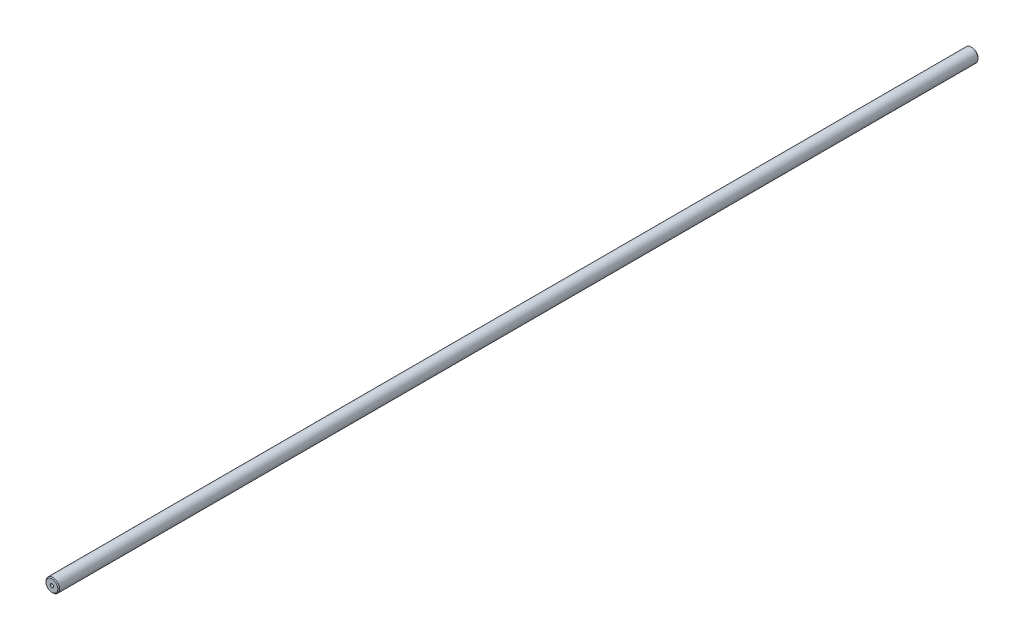
ISO-10303-21;
HEADER;
FILE_DESCRIPTION(('STEP AP214'),'2;1');
FILE_NAME('part.step','',(''),(''),'','','');
FILE_SCHEMA(('AUTOMOTIVE_DESIGN { 1 0 10303 214 1 1 1 1 }'));
ENDSEC;
DATA;
#1=APPLICATION_CONTEXT('core data for automotive mechanical design processes');
#2=APPLICATION_PROTOCOL_DEFINITION('international standard','automotive_design',2000,#1);
#3=PRODUCT_CONTEXT('',#1,'mechanical');
#4=PRODUCT('Part','Part','',(#3));
#5=PRODUCT_RELATED_PRODUCT_CATEGORY('part','',(#4));
#6=PRODUCT_DEFINITION_FORMATION('','',#4);
#7=PRODUCT_DEFINITION_CONTEXT('part definition',#1,'design');
#8=PRODUCT_DEFINITION('design','',#6,#7);
#9=PRODUCT_DEFINITION_SHAPE('','',#8);
#10=(LENGTH_UNIT() NAMED_UNIT(*) SI_UNIT(.MILLI.,.METRE.));
#11=(NAMED_UNIT(*) PLANE_ANGLE_UNIT() SI_UNIT($,.RADIAN.));
#12=(NAMED_UNIT(*) SI_UNIT($,.STERADIAN.) SOLID_ANGLE_UNIT());
#13=UNCERTAINTY_MEASURE_WITH_UNIT(LENGTH_MEASURE(1.E-05),#10,'distance_accuracy_value','');
#14=(GEOMETRIC_REPRESENTATION_CONTEXT(3) GLOBAL_UNCERTAINTY_ASSIGNED_CONTEXT((#13)) GLOBAL_UNIT_ASSIGNED_CONTEXT((#10,
#11,#12)) REPRESENTATION_CONTEXT('',''));
#15=CARTESIAN_POINT('',(0.,0.,0.));
#16=DIRECTION('',(0.,0.,1.));
#17=DIRECTION('',(1.,0.,0.));
#18=AXIS2_PLACEMENT_3D('',#15,#16,#17);
#19=CARTESIAN_POINT('',(0.,0.,544.));
#20=DIRECTION('',(0.,0.,-1.));
#21=DIRECTION('',(-1.,0.,0.));
#22=AXIS2_PLACEMENT_3D('',#19,#20,#21);
#23=CYLINDRICAL_SURFACE('',#22,4.);
#24=CARTESIAN_POINT('',(0.,0.,0.500000000000056));
#25=DIRECTION('',(0.,0.,1.));
#26=DIRECTION('',(1.,0.,0.));
#27=AXIS2_PLACEMENT_3D('',#24,#25,#26);
#28=CIRCLE('',#27,4.);
#29=CARTESIAN_POINT('',(4.,0.,0.500000000000056));
#30=VERTEX_POINT('',#29);
#31=EDGE_CURVE('E42',#30,#30,#28,.T.);
#32=ORIENTED_EDGE('',*,*,#31,.T.);
#33=EDGE_LOOP('',(#32));
#34=FACE_BOUND('',#33,.T.);
#35=CARTESIAN_POINT('',(0.,0.,543.5));
#36=DIRECTION('',(0.,0.,1.));
#37=DIRECTION('',(1.,0.,0.));
#38=AXIS2_PLACEMENT_3D('',#35,#36,#37);
#39=CIRCLE('',#38,4.);
#40=CARTESIAN_POINT('',(4.,0.,543.5));
#41=VERTEX_POINT('',#40);
#42=EDGE_CURVE('E46',#41,#41,#39,.F.);
#43=ORIENTED_EDGE('',*,*,#42,.T.);
#44=EDGE_LOOP('',(#43));
#45=FACE_BOUND('',#44,.T.);
#46=ADVANCED_FACE('F31',(#34,#45),#23,.T.);
#47=CARTESIAN_POINT('',(0.,0.,544.));
#48=DIRECTION('',(0.,0.,1.));
#49=DIRECTION('',(1.,0.,0.));
#50=AXIS2_PLACEMENT_3D('',#47,#48,#49);
#51=PLANE('',#50);
#52=CARTESIAN_POINT('',(0.,0.,544.));
#53=DIRECTION('',(0.,0.,1.));
#54=DIRECTION('',(1.,0.,0.));
#55=AXIS2_PLACEMENT_3D('',#52,#53,#54);
#56=CIRCLE('',#55,3.50000000000011);
#57=CARTESIAN_POINT('',(3.50000000000011,0.,544.));
#58=VERTEX_POINT('',#57);
#59=EDGE_CURVE('E10',#58,#58,#56,.T.);
#60=ORIENTED_EDGE('',*,*,#59,.T.);
#61=EDGE_LOOP('',(#60));
#62=FACE_BOUND('',#61,.T.);
#63=CARTESIAN_POINT('',(0.,0.,544.));
#64=DIRECTION('',(0.,0.,1.));
#65=DIRECTION('',(1.,0.,0.));
#66=AXIS2_PLACEMENT_3D('',#63,#64,#65);
#67=CIRCLE('',#66,1.);
#68=CARTESIAN_POINT('',(1.,0.,544.));
#69=VERTEX_POINT('',#68);
#70=EDGE_CURVE('E52',#69,#69,#67,.T.);
#71=ORIENTED_EDGE('',*,*,#70,.F.);
#72=EDGE_LOOP('',(#71));
#73=FACE_BOUND('',#72,.T.);
#74=ADVANCED_FACE('F67',(#62,#73),#51,.T.);
#75=CARTESIAN_POINT('',(0.,0.,0.));
#76=DIRECTION('',(0.,0.,1.));
#77=DIRECTION('',(1.,0.,0.));
#78=AXIS2_PLACEMENT_3D('',#75,#76,#77);
#79=PLANE('',#78);
#80=CARTESIAN_POINT('',(0.,0.,0.));
#81=DIRECTION('',(0.,0.,1.));
#82=DIRECTION('',(1.,0.,0.));
#83=AXIS2_PLACEMENT_3D('',#80,#81,#82);
#84=CIRCLE('',#83,3.49999999999995);
#85=CARTESIAN_POINT('',(3.49999999999995,0.,0.));
#86=VERTEX_POINT('',#85);
#87=EDGE_CURVE('E38',#86,#86,#84,.F.);
#88=ORIENTED_EDGE('',*,*,#87,.T.);
#89=EDGE_LOOP('',(#88));
#90=FACE_BOUND('',#89,.T.);
#91=ADVANCED_FACE('F63',(#90),#79,.F.);
#92=CARTESIAN_POINT('',(0.,0.,534.));
#93=DIRECTION('',(0.,0.,1.));
#94=DIRECTION('',(1.,0.,0.));
#95=AXIS2_PLACEMENT_3D('',#92,#93,#94);
#96=CYLINDRICAL_SURFACE('',#95,1.);
#97=CARTESIAN_POINT('',(0.,0.,534.));
#98=DIRECTION('',(0.,0.,1.));
#99=DIRECTION('',(1.,0.,0.));
#100=AXIS2_PLACEMENT_3D('',#97,#98,#99);
#101=CIRCLE('',#100,1.);
#102=CARTESIAN_POINT('',(1.,0.,534.));
#103=VERTEX_POINT('',#102);
#104=EDGE_CURVE('E51',#103,#103,#101,.T.);
#105=ORIENTED_EDGE('',*,*,#104,.F.);
#106=EDGE_LOOP('',(#105));
#107=FACE_BOUND('',#106,.T.);
#108=ORIENTED_EDGE('',*,*,#70,.T.);
#109=EDGE_LOOP('',(#108));
#110=FACE_BOUND('',#109,.T.);
#111=ADVANCED_FACE('F60',(#107,#110),#96,.F.);
#112=CARTESIAN_POINT('',(0.,0.,534.));
#113=DIRECTION('',(0.,0.,1.));
#114=DIRECTION('',(1.,0.,0.));
#115=AXIS2_PLACEMENT_3D('',#112,#113,#114);
#116=PLANE('',#115);
#117=ORIENTED_EDGE('',*,*,#104,.T.);
#118=EDGE_LOOP('',(#117));
#119=FACE_BOUND('',#118,.T.);
#120=ADVANCED_FACE('F58',(#119),#116,.T.);
#121=CARTESIAN_POINT('',(0.,0.,0.500000000000056));
#122=DIRECTION('',(0.,0.,1.));
#123=DIRECTION('',(1.,0.,0.));
#124=AXIS2_PLACEMENT_3D('',#121,#122,#123);
#125=CONICAL_SURFACE('',#124,4.,0.785398163397445);
#126=ORIENTED_EDGE('',*,*,#87,.F.);
#127=EDGE_LOOP('',(#126));
#128=FACE_BOUND('',#127,.T.);
#129=ORIENTED_EDGE('',*,*,#31,.F.);
#130=EDGE_LOOP('',(#129));
#131=FACE_BOUND('',#130,.T.);
#132=ADVANCED_FACE('F78',(#128,#131),#125,.T.);
#133=CARTESIAN_POINT('',(0.,0.,544.));
#134=DIRECTION('',(0.,0.,-1.));
#135=DIRECTION('',(-1.,0.,0.));
#136=AXIS2_PLACEMENT_3D('',#133,#134,#135);
#137=CONICAL_SURFACE('',#136,3.50000000000011,0.785398163397389);
#138=ORIENTED_EDGE('',*,*,#42,.F.);
#139=EDGE_LOOP('',(#138));
#140=FACE_BOUND('',#139,.T.);
#141=ORIENTED_EDGE('',*,*,#59,.F.);
#142=EDGE_LOOP('',(#141));
#143=FACE_BOUND('',#142,.T.);
#144=ADVANCED_FACE('F33',(#140,#143),#137,.T.);
#145=CLOSED_SHELL('',(#46,#74,#91,#111,#120,#132,#144));
#146=MANIFOLD_SOLID_BREP('B2',#145);
#147=ADVANCED_BREP_SHAPE_REPRESENTATION('',(#18,#146),#14);
#148=SHAPE_DEFINITION_REPRESENTATION(#9,#147);
ENDSEC;
END-ISO-10303-21;
